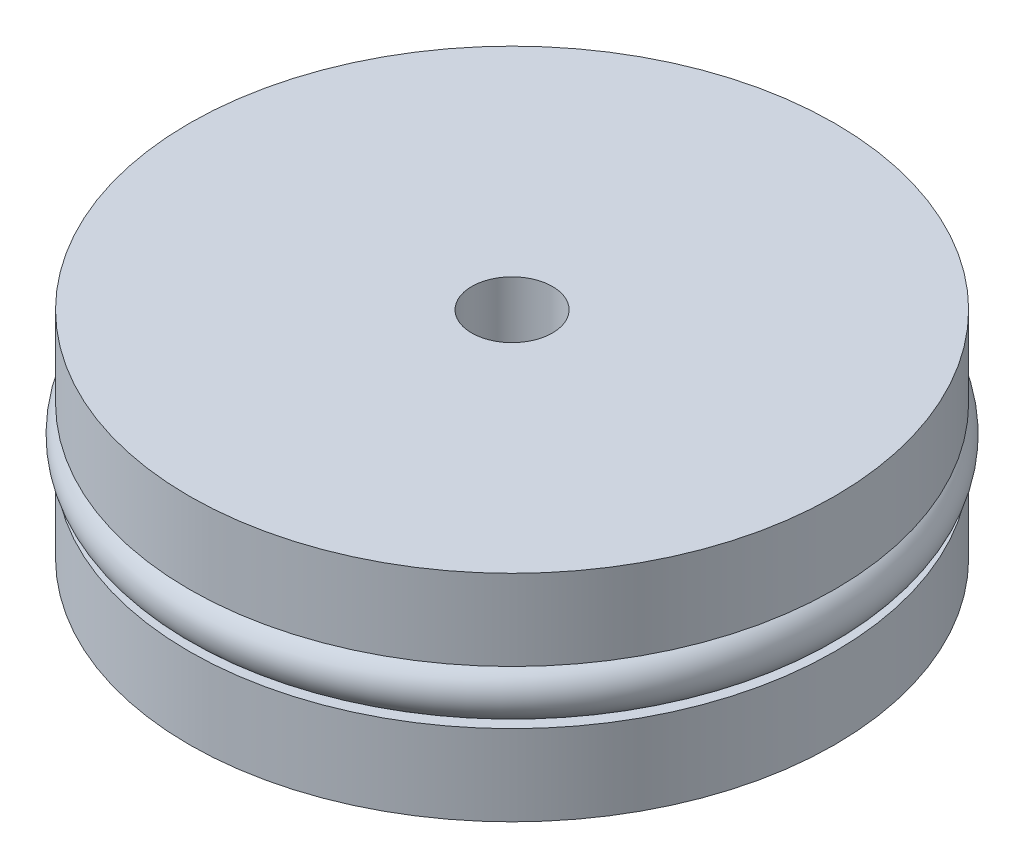
ISO-10303-21;
HEADER;
FILE_DESCRIPTION(('STEP AP214'),'2;1');
FILE_NAME('part.step','',(''),(''),'','','');
FILE_SCHEMA(('AUTOMOTIVE_DESIGN { 1 0 10303 214 1 1 1 1 }'));
ENDSEC;
DATA;
#1=APPLICATION_CONTEXT('core data for automotive mechanical design processes');
#2=APPLICATION_PROTOCOL_DEFINITION('international standard','automotive_design',2000,#1);
#3=PRODUCT_CONTEXT('',#1,'mechanical');
#4=PRODUCT('Part','Part','',(#3));
#5=PRODUCT_RELATED_PRODUCT_CATEGORY('part','',(#4));
#6=PRODUCT_DEFINITION_FORMATION('','',#4);
#7=PRODUCT_DEFINITION_CONTEXT('part definition',#1,'design');
#8=PRODUCT_DEFINITION('design','',#6,#7);
#9=PRODUCT_DEFINITION_SHAPE('','',#8);
#10=(LENGTH_UNIT() NAMED_UNIT(*) SI_UNIT(.MILLI.,.METRE.));
#11=(NAMED_UNIT(*) PLANE_ANGLE_UNIT() SI_UNIT($,.RADIAN.));
#12=(NAMED_UNIT(*) SI_UNIT($,.STERADIAN.) SOLID_ANGLE_UNIT());
#13=UNCERTAINTY_MEASURE_WITH_UNIT(LENGTH_MEASURE(1.E-05),#10,'distance_accuracy_value','');
#14=(GEOMETRIC_REPRESENTATION_CONTEXT(3) GLOBAL_UNCERTAINTY_ASSIGNED_CONTEXT((#13)) GLOBAL_UNIT_ASSIGNED_CONTEXT((#10,
#11,#12)) REPRESENTATION_CONTEXT('',''));
#15=CARTESIAN_POINT('',(0.,0.,0.));
#16=DIRECTION('',(0.,0.,1.));
#17=DIRECTION('',(1.,0.,0.));
#18=AXIS2_PLACEMENT_3D('',#15,#16,#17);
#19=CARTESIAN_POINT('',(0.,0.,0.));
#20=DIRECTION('',(0.,1.,0.));
#21=DIRECTION('',(-1.,0.,0.));
#22=AXIS2_PLACEMENT_3D('',#19,#20,#21);
#23=TOROIDAL_SURFACE('',#22,11.25,1.);
#24=CARTESIAN_POINT('',(-12.25,0.,0.));
#25=VERTEX_POINT('',#24);
#26=VERTEX_LOOP('',#25);
#27=FACE_BOUND('',#26,.T.);
#28=ADVANCED_FACE('F41',(#27),#23,.T.);
#29=CLOSED_SHELL('',(#28));
#30=MANIFOLD_SOLID_BREP('B2',#29);
#31=CARTESIAN_POINT('',(0.,4.,0.));
#32=DIRECTION('',(0.,-1.,0.));
#33=DIRECTION('',(0.,0.,-1.));
#34=AXIS2_PLACEMENT_3D('',#31,#32,#33);
#35=CYLINDRICAL_SURFACE('',#34,12.);
#36=CARTESIAN_POINT('',(0.,-4.,0.));
#37=DIRECTION('',(0.,1.,0.));
#38=DIRECTION('',(0.,0.,1.));
#39=AXIS2_PLACEMENT_3D('',#36,#37,#38);
#40=CIRCLE('',#39,12.);
#41=CARTESIAN_POINT('',(0.,-4.,12.));
#42=VERTEX_POINT('',#41);
#43=EDGE_CURVE('E58',#42,#42,#40,.T.);
#44=ORIENTED_EDGE('',*,*,#43,.T.);
#45=EDGE_LOOP('',(#44));
#46=FACE_BOUND('',#45,.T.);
#47=CARTESIAN_POINT('',(0.,-1.,0.));
#48=DIRECTION('',(0.,1.,0.));
#49=DIRECTION('',(0.,0.,1.));
#50=AXIS2_PLACEMENT_3D('',#47,#48,#49);
#51=CIRCLE('',#50,12.);
#52=CARTESIAN_POINT('',(0.,-1.,12.));
#53=VERTEX_POINT('',#52);
#54=EDGE_CURVE('E65',#53,#53,#51,.T.);
#55=ORIENTED_EDGE('',*,*,#54,.F.);
#56=EDGE_LOOP('',(#55));
#57=FACE_BOUND('',#56,.T.);
#58=ADVANCED_FACE('F54',(#46,#57),#35,.T.);
#59=CARTESIAN_POINT('',(0.,-4.,0.));
#60=DIRECTION('',(0.,1.,0.));
#61=DIRECTION('',(0.,0.,1.));
#62=AXIS2_PLACEMENT_3D('',#59,#60,#61);
#63=PLANE('',#62);
#64=CARTESIAN_POINT('',(0.,-4.,0.));
#65=DIRECTION('',(0.,1.,0.));
#66=DIRECTION('',(0.,0.,1.));
#67=AXIS2_PLACEMENT_3D('',#64,#65,#66);
#68=CIRCLE('',#67,1.5);
#69=CARTESIAN_POINT('',(0.,-4.,1.5));
#70=VERTEX_POINT('',#69);
#71=EDGE_CURVE('E76',#70,#70,#68,.T.);
#72=ORIENTED_EDGE('',*,*,#71,.T.);
#73=EDGE_LOOP('',(#72));
#74=FACE_BOUND('',#73,.T.);
#75=ORIENTED_EDGE('',*,*,#43,.F.);
#76=EDGE_LOOP('',(#75));
#77=FACE_BOUND('',#76,.T.);
#78=ADVANCED_FACE('F85',(#74,#77),#63,.F.);
#79=CARTESIAN_POINT('',(0.,-1.,0.));
#80=DIRECTION('',(0.,1.,0.));
#81=DIRECTION('',(0.,0.,1.));
#82=AXIS2_PLACEMENT_3D('',#79,#80,#81);
#83=PLANE('',#82);
#84=CARTESIAN_POINT('',(0.,-1.,0.));
#85=DIRECTION('',(0.,1.,0.));
#86=DIRECTION('',(0.,0.,1.));
#87=AXIS2_PLACEMENT_3D('',#84,#85,#86);
#88=CIRCLE('',#87,10.25);
#89=CARTESIAN_POINT('',(0.,-1.,10.25));
#90=VERTEX_POINT('',#89);
#91=EDGE_CURVE('E70',#90,#90,#88,.T.);
#92=ORIENTED_EDGE('',*,*,#91,.F.);
#93=EDGE_LOOP('',(#92));
#94=FACE_BOUND('',#93,.T.);
#95=ORIENTED_EDGE('',*,*,#54,.T.);
#96=EDGE_LOOP('',(#95));
#97=FACE_BOUND('',#96,.T.);
#98=ADVANCED_FACE('F112',(#94,#97),#83,.T.);
#99=CARTESIAN_POINT('',(0.,1.,0.));
#100=DIRECTION('',(0.,1.,0.));
#101=DIRECTION('',(0.,0.,1.));
#102=AXIS2_PLACEMENT_3D('',#99,#100,#101);
#103=PLANE('',#102);
#104=CARTESIAN_POINT('',(0.,1.,0.));
#105=DIRECTION('',(0.,1.,0.));
#106=DIRECTION('',(0.,0.,1.));
#107=AXIS2_PLACEMENT_3D('',#104,#105,#106);
#108=CIRCLE('',#107,10.25);
#109=CARTESIAN_POINT('',(0.,1.,10.25));
#110=VERTEX_POINT('',#109);
#111=EDGE_CURVE('E73',#110,#110,#108,.T.);
#112=ORIENTED_EDGE('',*,*,#111,.T.);
#113=EDGE_LOOP('',(#112));
#114=FACE_BOUND('',#113,.T.);
#115=CARTESIAN_POINT('',(0.,1.,0.));
#116=DIRECTION('',(0.,1.,0.));
#117=DIRECTION('',(0.,0.,1.));
#118=AXIS2_PLACEMENT_3D('',#115,#116,#117);
#119=CIRCLE('',#118,12.);
#120=CARTESIAN_POINT('',(0.,1.,12.));
#121=VERTEX_POINT('',#120);
#122=EDGE_CURVE('E67',#121,#121,#119,.T.);
#123=ORIENTED_EDGE('',*,*,#122,.F.);
#124=EDGE_LOOP('',(#123));
#125=FACE_BOUND('',#124,.T.);
#126=ADVANCED_FACE('F103',(#114,#125),#103,.F.);
#127=CARTESIAN_POINT('',(0.,-1.,0.));
#128=DIRECTION('',(0.,1.,0.));
#129=DIRECTION('',(0.,0.,1.));
#130=AXIS2_PLACEMENT_3D('',#127,#128,#129);
#131=CYLINDRICAL_SURFACE('',#130,10.25);
#132=ORIENTED_EDGE('',*,*,#91,.T.);
#133=EDGE_LOOP('',(#132));
#134=FACE_BOUND('',#133,.T.);
#135=ORIENTED_EDGE('',*,*,#111,.F.);
#136=EDGE_LOOP('',(#135));
#137=FACE_BOUND('',#136,.T.);
#138=ADVANCED_FACE('F96',(#134,#137),#131,.T.);
#139=CARTESIAN_POINT('',(0.,4.,0.));
#140=DIRECTION('',(0.,1.,0.));
#141=DIRECTION('',(0.,0.,1.));
#142=AXIS2_PLACEMENT_3D('',#139,#140,#141);
#143=PLANE('',#142);
#144=CARTESIAN_POINT('',(0.,4.,0.));
#145=DIRECTION('',(0.,1.,0.));
#146=DIRECTION('',(0.,0.,1.));
#147=AXIS2_PLACEMENT_3D('',#144,#145,#146);
#148=CIRCLE('',#147,1.5);
#149=CARTESIAN_POINT('',(0.,4.,1.5));
#150=VERTEX_POINT('',#149);
#151=EDGE_CURVE('E79',#150,#150,#148,.T.);
#152=ORIENTED_EDGE('',*,*,#151,.F.);
#153=EDGE_LOOP('',(#152));
#154=FACE_BOUND('',#153,.T.);
#155=CARTESIAN_POINT('',(0.,4.,0.));
#156=DIRECTION('',(0.,1.,0.));
#157=DIRECTION('',(0.,0.,1.));
#158=AXIS2_PLACEMENT_3D('',#155,#156,#157);
#159=CIRCLE('',#158,12.);
#160=CARTESIAN_POINT('',(0.,4.,12.));
#161=VERTEX_POINT('',#160);
#162=EDGE_CURVE('E40',#161,#161,#159,.T.);
#163=ORIENTED_EDGE('',*,*,#162,.T.);
#164=EDGE_LOOP('',(#163));
#165=FACE_BOUND('',#164,.T.);
#166=ADVANCED_FACE('F94',(#154,#165),#143,.T.);
#167=ORIENTED_EDGE('',*,*,#122,.T.);
#168=EDGE_LOOP('',(#167));
#169=FACE_BOUND('',#168,.T.);
#170=ORIENTED_EDGE('',*,*,#162,.F.);
#171=EDGE_LOOP('',(#170));
#172=FACE_BOUND('',#171,.T.);
#173=ADVANCED_FACE('F56',(#169,#172),#35,.T.);
#174=CARTESIAN_POINT('',(0.,-4.,0.));
#175=DIRECTION('',(0.,1.,0.));
#176=DIRECTION('',(0.,0.,1.));
#177=AXIS2_PLACEMENT_3D('',#174,#175,#176);
#178=CYLINDRICAL_SURFACE('',#177,1.5);
#179=ORIENTED_EDGE('',*,*,#71,.F.);
#180=EDGE_LOOP('',(#179));
#181=FACE_BOUND('',#180,.T.);
#182=ORIENTED_EDGE('',*,*,#151,.T.);
#183=EDGE_LOOP('',(#182));
#184=FACE_BOUND('',#183,.T.);
#185=ADVANCED_FACE('F88',(#181,#184),#178,.F.);
#186=CLOSED_SHELL('',(#58,#78,#98,#126,#138,#166,#173,#185));
#187=MANIFOLD_SOLID_BREP('B6',#186);
#188=ADVANCED_BREP_SHAPE_REPRESENTATION('',(#18,#30,#187),#14);
#189=SHAPE_DEFINITION_REPRESENTATION(#9,#188);
ENDSEC;
END-ISO-10303-21;
